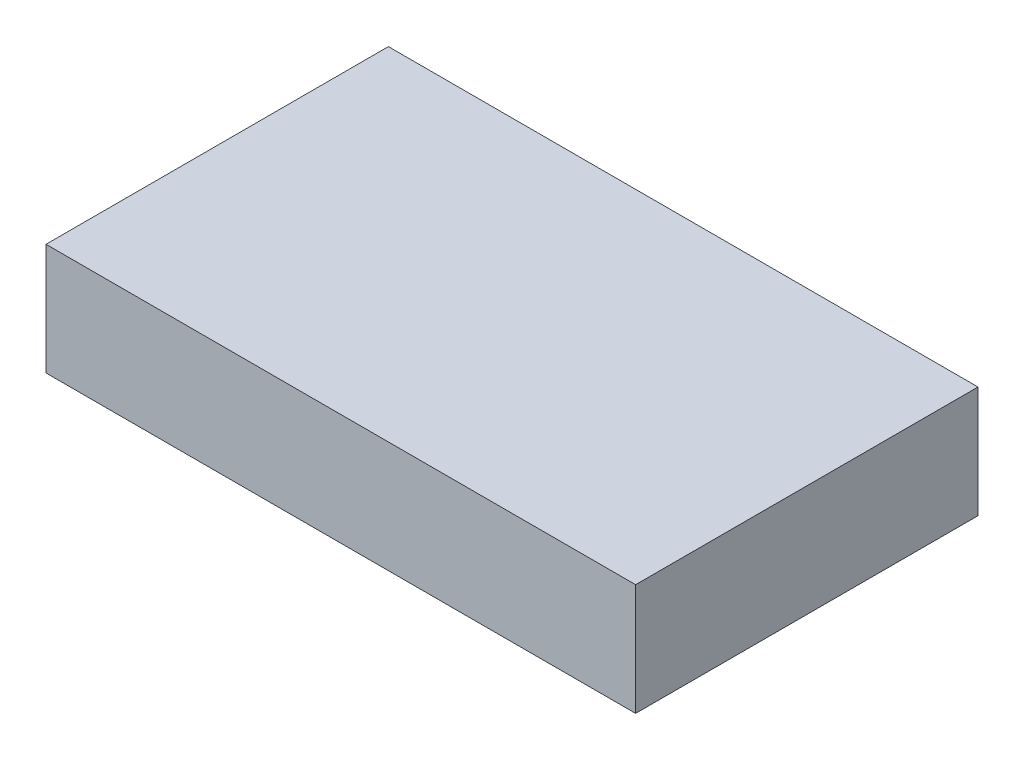
ISO-10303-21;
HEADER;
FILE_DESCRIPTION(('STEP AP214'),'2;1');
FILE_NAME('part.step','',(''),(''),'','','');
FILE_SCHEMA(('AUTOMOTIVE_DESIGN { 1 0 10303 214 1 1 1 1 }'));
ENDSEC;
DATA;
#1=APPLICATION_CONTEXT('core data for automotive mechanical design processes');
#2=APPLICATION_PROTOCOL_DEFINITION('international standard','automotive_design',2000,#1);
#3=PRODUCT_CONTEXT('',#1,'mechanical');
#4=PRODUCT('Part','Part','',(#3));
#5=PRODUCT_RELATED_PRODUCT_CATEGORY('part','',(#4));
#6=PRODUCT_DEFINITION_FORMATION('','',#4);
#7=PRODUCT_DEFINITION_CONTEXT('part definition',#1,'design');
#8=PRODUCT_DEFINITION('design','',#6,#7);
#9=PRODUCT_DEFINITION_SHAPE('','',#8);
#10=(LENGTH_UNIT() NAMED_UNIT(*) SI_UNIT(.MILLI.,.METRE.));
#11=(NAMED_UNIT(*) PLANE_ANGLE_UNIT() SI_UNIT($,.RADIAN.));
#12=(NAMED_UNIT(*) SI_UNIT($,.STERADIAN.) SOLID_ANGLE_UNIT());
#13=UNCERTAINTY_MEASURE_WITH_UNIT(LENGTH_MEASURE(1.E-05),#10,'distance_accuracy_value','');
#14=(GEOMETRIC_REPRESENTATION_CONTEXT(3) GLOBAL_UNCERTAINTY_ASSIGNED_CONTEXT((#13)) GLOBAL_UNIT_ASSIGNED_CONTEXT((#10,
#11,#12)) REPRESENTATION_CONTEXT('',''));
#15=CARTESIAN_POINT('',(0.,0.,0.));
#16=DIRECTION('',(0.,0.,1.));
#17=DIRECTION('',(1.,0.,0.));
#18=AXIS2_PLACEMENT_3D('',#15,#16,#17);
#19=CARTESIAN_POINT('',(11.1071792813592,2.10000000000008,12.9));
#20=DIRECTION('',(-1.,0.,0.));
#21=DIRECTION('',(0.,0.,1.));
#22=AXIS2_PLACEMENT_3D('',#19,#20,#21);
#23=PLANE('',#22);
#24=DIRECTION('',(0.,1.,0.));
#25=VECTOR('',#24,1.);
#26=CARTESIAN_POINT('',(11.1071792813592,2.10000000000008,0.));
#27=LINE('',#26,#25);
#28=CARTESIAN_POINT('',(11.1071792813592,-2.09999999999992,0.));
#29=VERTEX_POINT('',#28);
#30=CARTESIAN_POINT('',(11.1071792813592,2.10000000000008,0.));
#31=VERTEX_POINT('',#30);
#32=EDGE_CURVE('E102',#29,#31,#27,.T.);
#33=ORIENTED_EDGE('',*,*,#32,.T.);
#34=DIRECTION('',(0.,0.,-1.));
#35=VECTOR('',#34,1.);
#36=CARTESIAN_POINT('',(11.1071792813592,2.10000000000008,12.9));
#37=LINE('',#36,#35);
#38=CARTESIAN_POINT('',(11.1071792813592,2.10000000000008,12.9));
#39=VERTEX_POINT('',#38);
#40=EDGE_CURVE('E11',#39,#31,#37,.T.);
#41=ORIENTED_EDGE('',*,*,#40,.F.);
#42=DIRECTION('',(0.,1.,0.));
#43=VECTOR('',#42,1.);
#44=CARTESIAN_POINT('',(11.1071792813592,2.10000000000008,12.9));
#45=LINE('',#44,#43);
#46=CARTESIAN_POINT('',(11.1071792813592,-2.09999999999992,12.9));
#47=VERTEX_POINT('',#46);
#48=EDGE_CURVE('E90',#47,#39,#45,.T.);
#49=ORIENTED_EDGE('',*,*,#48,.F.);
#50=DIRECTION('',(0.,0.,-1.));
#51=VECTOR('',#50,1.);
#52=CARTESIAN_POINT('',(11.1071792813592,-2.09999999999992,12.9));
#53=LINE('',#52,#51);
#54=EDGE_CURVE('E98',#47,#29,#53,.T.);
#55=ORIENTED_EDGE('',*,*,#54,.T.);
#56=EDGE_LOOP('',(#33,#41,#49,#55));
#57=FACE_BOUND('',#56,.T.);
#58=ADVANCED_FACE('F39',(#57),#23,.F.);
#59=CARTESIAN_POINT('',(-11.1071792813592,2.10000000000008,12.9));
#60=DIRECTION('',(0.,-1.,0.));
#61=DIRECTION('',(0.,0.,-1.));
#62=AXIS2_PLACEMENT_3D('',#59,#60,#61);
#63=PLANE('',#62);
#64=DIRECTION('',(-1.,0.,0.));
#65=VECTOR('',#64,1.);
#66=CARTESIAN_POINT('',(-11.1071792813592,2.10000000000008,0.));
#67=LINE('',#66,#65);
#68=CARTESIAN_POINT('',(-11.1071792813592,2.10000000000008,0.));
#69=VERTEX_POINT('',#68);
#70=EDGE_CURVE('E94',#31,#69,#67,.T.);
#71=ORIENTED_EDGE('',*,*,#70,.T.);
#72=DIRECTION('',(0.,0.,-1.));
#73=VECTOR('',#72,1.);
#74=CARTESIAN_POINT('',(-11.1071792813592,2.10000000000008,12.9));
#75=LINE('',#74,#73);
#76=CARTESIAN_POINT('',(-11.1071792813592,2.10000000000008,12.9));
#77=VERTEX_POINT('',#76);
#78=EDGE_CURVE('E47',#77,#69,#75,.T.);
#79=ORIENTED_EDGE('',*,*,#78,.F.);
#80=DIRECTION('',(-1.,0.,0.));
#81=VECTOR('',#80,1.);
#82=CARTESIAN_POINT('',(-11.1071792813592,2.10000000000008,12.9));
#83=LINE('',#82,#81);
#84=EDGE_CURVE('E85',#39,#77,#83,.T.);
#85=ORIENTED_EDGE('',*,*,#84,.F.);
#86=ORIENTED_EDGE('',*,*,#40,.T.);
#87=EDGE_LOOP('',(#71,#79,#85,#86));
#88=FACE_BOUND('',#87,.T.);
#89=ADVANCED_FACE('F93',(#88),#63,.F.);
#90=CARTESIAN_POINT('',(-11.1071792813592,-2.10000000000008,12.9));
#91=DIRECTION('',(1.,0.,0.));
#92=DIRECTION('',(0.,0.,-1.));
#93=AXIS2_PLACEMENT_3D('',#90,#91,#92);
#94=PLANE('',#93);
#95=DIRECTION('',(0.,-1.,0.));
#96=VECTOR('',#95,1.);
#97=CARTESIAN_POINT('',(-11.1071792813592,-2.10000000000008,0.));
#98=LINE('',#97,#96);
#99=CARTESIAN_POINT('',(-11.1071792813592,-2.10000000000008,0.));
#100=VERTEX_POINT('',#99);
#101=EDGE_CURVE('E72',#69,#100,#98,.T.);
#102=ORIENTED_EDGE('',*,*,#101,.T.);
#103=DIRECTION('',(0.,0.,-1.));
#104=VECTOR('',#103,1.);
#105=CARTESIAN_POINT('',(-11.1071792813592,-2.10000000000008,12.9));
#106=LINE('',#105,#104);
#107=CARTESIAN_POINT('',(-11.1071792813592,-2.10000000000008,12.9));
#108=VERTEX_POINT('',#107);
#109=EDGE_CURVE('E95',#108,#100,#106,.T.);
#110=ORIENTED_EDGE('',*,*,#109,.F.);
#111=DIRECTION('',(0.,-1.,0.));
#112=VECTOR('',#111,1.);
#113=CARTESIAN_POINT('',(-11.1071792813592,-2.10000000000008,12.9));
#114=LINE('',#113,#112);
#115=EDGE_CURVE('E88',#77,#108,#114,.T.);
#116=ORIENTED_EDGE('',*,*,#115,.F.);
#117=ORIENTED_EDGE('',*,*,#78,.T.);
#118=EDGE_LOOP('',(#102,#110,#116,#117));
#119=FACE_BOUND('',#118,.T.);
#120=ADVANCED_FACE('F96',(#119),#94,.F.);
#121=CARTESIAN_POINT('',(11.1071792813592,-2.09999999999992,12.9));
#122=DIRECTION('',(0.,1.,0.));
#123=DIRECTION('',(-1.,0.,0.));
#124=AXIS2_PLACEMENT_3D('',#121,#122,#123);
#125=PLANE('',#124);
#126=DIRECTION('',(1.,0.,0.));
#127=VECTOR('',#126,1.);
#128=CARTESIAN_POINT('',(11.1071792813592,-2.09999999999992,0.));
#129=LINE('',#128,#127);
#130=EDGE_CURVE('E78',#100,#29,#129,.T.);
#131=ORIENTED_EDGE('',*,*,#130,.T.);
#132=ORIENTED_EDGE('',*,*,#54,.F.);
#133=DIRECTION('',(1.,0.,0.));
#134=VECTOR('',#133,1.);
#135=CARTESIAN_POINT('',(11.1071792813592,-2.09999999999992,12.9));
#136=LINE('',#135,#134);
#137=EDGE_CURVE('E55',#108,#47,#136,.T.);
#138=ORIENTED_EDGE('',*,*,#137,.F.);
#139=ORIENTED_EDGE('',*,*,#109,.T.);
#140=EDGE_LOOP('',(#131,#132,#138,#139));
#141=FACE_BOUND('',#140,.T.);
#142=ADVANCED_FACE('F109',(#141),#125,.F.);
#143=CARTESIAN_POINT('',(0.,0.,12.9));
#144=DIRECTION('',(0.,0.,-1.));
#145=DIRECTION('',(-1.,0.,0.));
#146=AXIS2_PLACEMENT_3D('',#143,#144,#145);
#147=PLANE('',#146);
#148=ORIENTED_EDGE('',*,*,#48,.T.);
#149=ORIENTED_EDGE('',*,*,#84,.T.);
#150=ORIENTED_EDGE('',*,*,#115,.T.);
#151=ORIENTED_EDGE('',*,*,#137,.T.);
#152=EDGE_LOOP('',(#148,#149,#150,#151));
#153=FACE_BOUND('',#152,.T.);
#154=ADVANCED_FACE('F86',(#153),#147,.F.);
#155=CARTESIAN_POINT('',(0.,0.,0.));
#156=DIRECTION('',(0.,0.,-1.));
#157=DIRECTION('',(-1.,0.,0.));
#158=AXIS2_PLACEMENT_3D('',#155,#156,#157);
#159=PLANE('',#158);
#160=ORIENTED_EDGE('',*,*,#32,.F.);
#161=ORIENTED_EDGE('',*,*,#130,.F.);
#162=ORIENTED_EDGE('',*,*,#101,.F.);
#163=ORIENTED_EDGE('',*,*,#70,.F.);
#164=EDGE_LOOP('',(#160,#161,#162,#163));
#165=FACE_BOUND('',#164,.T.);
#166=ADVANCED_FACE('F112',(#165),#159,.T.);
#167=CLOSED_SHELL('',(#58,#89,#120,#142,#154,#166));
#168=MANIFOLD_SOLID_BREP('B2',#167);
#169=ADVANCED_BREP_SHAPE_REPRESENTATION('',(#18,#168),#14);
#170=SHAPE_DEFINITION_REPRESENTATION(#9,#169);
ENDSEC;
END-ISO-10303-21;
